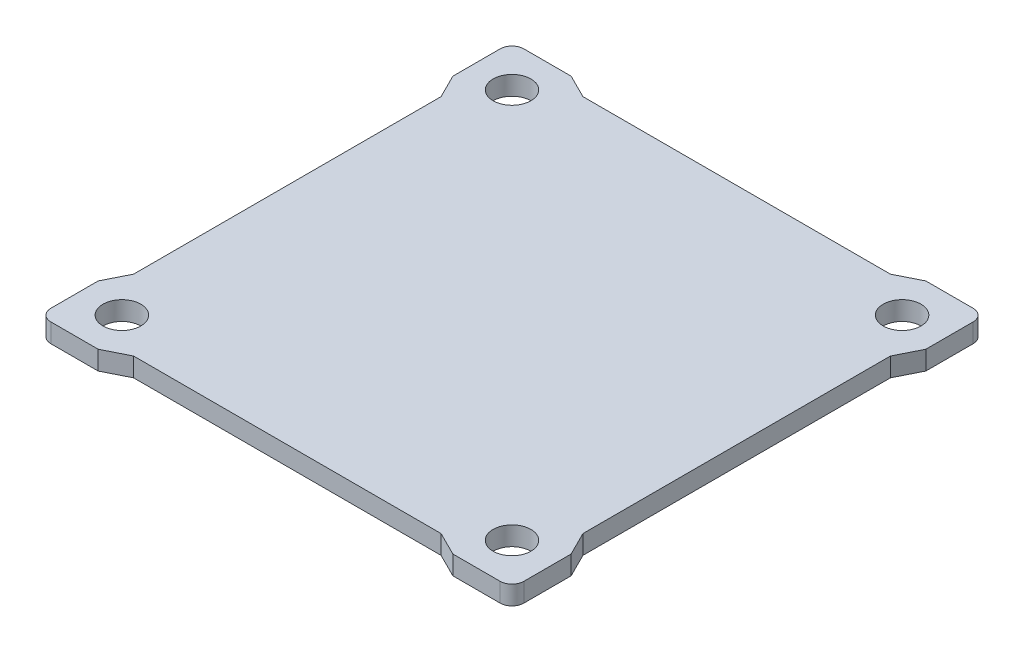
ISO-10303-21;
HEADER;
FILE_DESCRIPTION(('STEP AP214'),'2;1');
FILE_NAME('part.step','',(''),(''),'','','');
FILE_SCHEMA(('AUTOMOTIVE_DESIGN { 1 0 10303 214 1 1 1 1 }'));
ENDSEC;
DATA;
#1=APPLICATION_CONTEXT('core data for automotive mechanical design processes');
#2=APPLICATION_PROTOCOL_DEFINITION('international standard','automotive_design',2000,#1);
#3=PRODUCT_CONTEXT('',#1,'mechanical');
#4=PRODUCT('Part','Part','',(#3));
#5=PRODUCT_RELATED_PRODUCT_CATEGORY('part','',(#4));
#6=PRODUCT_DEFINITION_FORMATION('','',#4);
#7=PRODUCT_DEFINITION_CONTEXT('part definition',#1,'design');
#8=PRODUCT_DEFINITION('design','',#6,#7);
#9=PRODUCT_DEFINITION_SHAPE('','',#8);
#10=(LENGTH_UNIT() NAMED_UNIT(*) SI_UNIT(.MILLI.,.METRE.));
#11=(NAMED_UNIT(*) PLANE_ANGLE_UNIT() SI_UNIT($,.RADIAN.));
#12=(NAMED_UNIT(*) SI_UNIT($,.STERADIAN.) SOLID_ANGLE_UNIT());
#13=UNCERTAINTY_MEASURE_WITH_UNIT(LENGTH_MEASURE(1.E-05),#10,'distance_accuracy_value','');
#14=(GEOMETRIC_REPRESENTATION_CONTEXT(3) GLOBAL_UNCERTAINTY_ASSIGNED_CONTEXT((#13)) GLOBAL_UNIT_ASSIGNED_CONTEXT((#10,
#11,#12)) REPRESENTATION_CONTEXT('',''));
#15=CARTESIAN_POINT('',(0.,0.,0.));
#16=DIRECTION('',(0.,0.,1.));
#17=DIRECTION('',(1.,0.,0.));
#18=AXIS2_PLACEMENT_3D('',#15,#16,#17);
#19=CARTESIAN_POINT('',(0.,0.,0.));
#20=DIRECTION('',(0.,0.,-1.));
#21=DIRECTION('',(-1.,0.,0.));
#22=AXIS2_PLACEMENT_3D('',#19,#20,#21);
#23=PLANE('',#22);
#24=DIRECTION('',(1.,0.,0.));
#25=VECTOR('',#24,1.);
#26=CARTESIAN_POINT('',(0.,-1.6,0.));
#27=LINE('',#26,#25);
#28=CARTESIAN_POINT('',(35.,-1.6,1.45716771982052E-13));
#29=VERTEX_POINT('',#28);
#30=CARTESIAN_POINT('',(39.,-1.6,0.));
#31=VERTEX_POINT('',#30);
#32=EDGE_CURVE('E311',#29,#31,#27,.T.);
#33=ORIENTED_EDGE('',*,*,#32,.T.);
#34=DIRECTION('',(0.,-1.,0.));
#35=VECTOR('',#34,1.);
#36=CARTESIAN_POINT('',(39.,0.,0.));
#37=LINE('',#36,#35);
#38=CARTESIAN_POINT('',(39.,0.,0.));
#39=VERTEX_POINT('',#38);
#40=EDGE_CURVE('E327',#31,#39,#37,.F.);
#41=ORIENTED_EDGE('',*,*,#40,.T.);
#42=DIRECTION('',(1.,0.,0.));
#43=VECTOR('',#42,1.);
#44=CARTESIAN_POINT('',(0.,0.,0.));
#45=LINE('',#44,#43);
#46=CARTESIAN_POINT('',(35.,0.,1.45716771982052E-13));
#47=VERTEX_POINT('',#46);
#48=EDGE_CURVE('E301',#47,#39,#45,.T.);
#49=ORIENTED_EDGE('',*,*,#48,.F.);
#50=DIRECTION('',(0.,1.,0.));
#51=VECTOR('',#50,1.);
#52=CARTESIAN_POINT('',(35.,-1.6,1.45716771982052E-13));
#53=LINE('',#52,#51);
#54=EDGE_CURVE('E236',#29,#47,#53,.T.);
#55=ORIENTED_EDGE('',*,*,#54,.F.);
#56=EDGE_LOOP('',(#33,#41,#49,#55));
#57=FACE_BOUND('',#56,.T.);
#58=ADVANCED_FACE('F16',(#57),#23,.F.);
#59=CARTESIAN_POINT('',(40.,0.,-40.));
#60=DIRECTION('',(1.,0.,0.));
#61=DIRECTION('',(0.,0.,-1.));
#62=AXIS2_PLACEMENT_3D('',#59,#60,#61);
#63=PLANE('',#62);
#64=DIRECTION('',(0.,0.,1.));
#65=VECTOR('',#64,1.);
#66=CARTESIAN_POINT('',(40.,0.,-40.));
#67=LINE('',#66,#65);
#68=CARTESIAN_POINT('',(40.,0.,-5.));
#69=VERTEX_POINT('',#68);
#70=CARTESIAN_POINT('',(40.,0.,-1.));
#71=VERTEX_POINT('',#70);
#72=EDGE_CURVE('E300',#69,#71,#67,.T.);
#73=ORIENTED_EDGE('',*,*,#72,.T.);
#74=DIRECTION('',(0.,-1.,0.));
#75=VECTOR('',#74,1.);
#76=CARTESIAN_POINT('',(40.,-1.6,-1.));
#77=LINE('',#76,#75);
#78=CARTESIAN_POINT('',(40.,-1.6,-1.));
#79=VERTEX_POINT('',#78);
#80=EDGE_CURVE('E309',#71,#79,#77,.T.);
#81=ORIENTED_EDGE('',*,*,#80,.T.);
#82=DIRECTION('',(0.,0.,1.));
#83=VECTOR('',#82,1.);
#84=CARTESIAN_POINT('',(40.,-1.6,-40.));
#85=LINE('',#84,#83);
#86=CARTESIAN_POINT('',(40.,-1.6,-5.));
#87=VERTEX_POINT('',#86);
#88=EDGE_CURVE('E192',#87,#79,#85,.T.);
#89=ORIENTED_EDGE('',*,*,#88,.F.);
#90=DIRECTION('',(0.,1.,0.));
#91=VECTOR('',#90,1.);
#92=CARTESIAN_POINT('',(40.,-1.6,-5.));
#93=LINE('',#92,#91);
#94=EDGE_CURVE('E396',#87,#69,#93,.T.);
#95=ORIENTED_EDGE('',*,*,#94,.T.);
#96=EDGE_LOOP('',(#73,#81,#89,#95));
#97=FACE_BOUND('',#96,.T.);
#98=ADVANCED_FACE('F411',(#97),#63,.T.);
#99=CARTESIAN_POINT('',(0.,0.,-40.));
#100=DIRECTION('',(0.,0.,-1.));
#101=DIRECTION('',(-1.,0.,0.));
#102=AXIS2_PLACEMENT_3D('',#99,#100,#101);
#103=PLANE('',#102);
#104=DIRECTION('',(1.,0.,0.));
#105=VECTOR('',#104,1.);
#106=CARTESIAN_POINT('',(0.,-1.6,-40.));
#107=LINE('',#106,#105);
#108=CARTESIAN_POINT('',(1.,-1.6,-40.));
#109=VERTEX_POINT('',#108);
#110=CARTESIAN_POINT('',(4.99999999999985,-1.6,-40.));
#111=VERTEX_POINT('',#110);
#112=EDGE_CURVE('E313',#109,#111,#107,.T.);
#113=ORIENTED_EDGE('',*,*,#112,.F.);
#114=DIRECTION('',(0.,-1.,0.));
#115=VECTOR('',#114,1.);
#116=CARTESIAN_POINT('',(1.,0.,-40.));
#117=LINE('',#116,#115);
#118=CARTESIAN_POINT('',(1.,0.,-40.));
#119=VERTEX_POINT('',#118);
#120=EDGE_CURVE('E343',#109,#119,#117,.F.);
#121=ORIENTED_EDGE('',*,*,#120,.T.);
#122=DIRECTION('',(1.,0.,0.));
#123=VECTOR('',#122,1.);
#124=CARTESIAN_POINT('',(0.,0.,-40.));
#125=LINE('',#124,#123);
#126=CARTESIAN_POINT('',(4.99999999999985,0.,-40.));
#127=VERTEX_POINT('',#126);
#128=EDGE_CURVE('E304',#119,#127,#125,.T.);
#129=ORIENTED_EDGE('',*,*,#128,.T.);
#130=DIRECTION('',(0.,1.,0.));
#131=VECTOR('',#130,1.);
#132=CARTESIAN_POINT('',(4.99999999999985,-1.6,-40.));
#133=LINE('',#132,#131);
#134=EDGE_CURVE('E260',#111,#127,#133,.T.);
#135=ORIENTED_EDGE('',*,*,#134,.F.);
#136=EDGE_LOOP('',(#113,#121,#129,#135));
#137=FACE_BOUND('',#136,.T.);
#138=ADVANCED_FACE('F467',(#137),#103,.T.);
#139=CARTESIAN_POINT('',(0.,0.,-40.));
#140=DIRECTION('',(1.,0.,0.));
#141=DIRECTION('',(0.,0.,-1.));
#142=AXIS2_PLACEMENT_3D('',#139,#140,#141);
#143=PLANE('',#142);
#144=DIRECTION('',(0.,0.,1.));
#145=VECTOR('',#144,1.);
#146=CARTESIAN_POINT('',(0.,-1.6,-40.));
#147=LINE('',#146,#145);
#148=CARTESIAN_POINT('',(2.35922392732846E-13,-1.6,-4.99999999999947));
#149=VERTEX_POINT('',#148);
#150=CARTESIAN_POINT('',(0.,-1.6,-1.));
#151=VERTEX_POINT('',#150);
#152=EDGE_CURVE('E315',#149,#151,#147,.T.);
#153=ORIENTED_EDGE('',*,*,#152,.T.);
#154=DIRECTION('',(0.,-1.,0.));
#155=VECTOR('',#154,1.);
#156=CARTESIAN_POINT('',(0.,0.,-1.));
#157=LINE('',#156,#155);
#158=CARTESIAN_POINT('',(0.,0.,-1.));
#159=VERTEX_POINT('',#158);
#160=EDGE_CURVE('E41',#151,#159,#157,.F.);
#161=ORIENTED_EDGE('',*,*,#160,.T.);
#162=DIRECTION('',(0.,0.,1.));
#163=VECTOR('',#162,1.);
#164=CARTESIAN_POINT('',(0.,0.,-40.));
#165=LINE('',#164,#163);
#166=CARTESIAN_POINT('',(2.35922392732846E-13,0.,-4.99999999999947));
#167=VERTEX_POINT('',#166);
#168=EDGE_CURVE('E306',#167,#159,#165,.T.);
#169=ORIENTED_EDGE('',*,*,#168,.F.);
#170=DIRECTION('',(0.,1.,0.));
#171=VECTOR('',#170,1.);
#172=CARTESIAN_POINT('',(2.35922392732846E-13,-1.6,-4.99999999999947));
#173=LINE('',#172,#171);
#174=EDGE_CURVE('E231',#149,#167,#173,.T.);
#175=ORIENTED_EDGE('',*,*,#174,.F.);
#176=EDGE_LOOP('',(#153,#161,#169,#175));
#177=FACE_BOUND('',#176,.T.);
#178=ADVANCED_FACE('F441',(#177),#143,.F.);
#179=CARTESIAN_POINT('',(1.,0.,0.));
#180=VERTEX_POINT('',#179);
#181=CARTESIAN_POINT('',(5.00000000000037,0.,1.52655665885959E-13));
#182=VERTEX_POINT('',#181);
#183=EDGE_CURVE('E298',#180,#182,#45,.T.);
#184=ORIENTED_EDGE('',*,*,#183,.F.);
#185=DIRECTION('',(0.,-1.,0.));
#186=VECTOR('',#185,1.);
#187=CARTESIAN_POINT('',(1.,0.,0.));
#188=LINE('',#187,#186);
#189=CARTESIAN_POINT('',(1.,-1.6,0.));
#190=VERTEX_POINT('',#189);
#191=EDGE_CURVE('E336',#180,#190,#188,.T.);
#192=ORIENTED_EDGE('',*,*,#191,.T.);
#193=CARTESIAN_POINT('',(5.00000000000037,-1.6,1.52655665885959E-13));
#194=VERTEX_POINT('',#193);
#195=EDGE_CURVE('E310',#190,#194,#27,.T.);
#196=ORIENTED_EDGE('',*,*,#195,.T.);
#197=DIRECTION('',(0.,1.,0.));
#198=VECTOR('',#197,1.);
#199=CARTESIAN_POINT('',(5.00000000000037,-1.6,1.52655665885959E-13));
#200=LINE('',#199,#198);
#201=EDGE_CURVE('E239',#194,#182,#200,.T.);
#202=ORIENTED_EDGE('',*,*,#201,.T.);
#203=EDGE_LOOP('',(#184,#192,#196,#202));
#204=FACE_BOUND('',#203,.T.);
#205=ADVANCED_FACE('F435',(#204),#23,.F.);
#206=CARTESIAN_POINT('',(40.,-1.6,-39.));
#207=VERTEX_POINT('',#206);
#208=CARTESIAN_POINT('',(40.,-1.6,-35.));
#209=VERTEX_POINT('',#208);
#210=EDGE_CURVE('E180',#207,#209,#85,.T.);
#211=ORIENTED_EDGE('',*,*,#210,.F.);
#212=DIRECTION('',(0.,-1.,0.));
#213=VECTOR('',#212,1.);
#214=CARTESIAN_POINT('',(40.,0.,-39.));
#215=LINE('',#214,#213);
#216=CARTESIAN_POINT('',(40.,0.,-39.));
#217=VERTEX_POINT('',#216);
#218=EDGE_CURVE('E11',#207,#217,#215,.F.);
#219=ORIENTED_EDGE('',*,*,#218,.T.);
#220=CARTESIAN_POINT('',(40.,0.,-35.));
#221=VERTEX_POINT('',#220);
#222=EDGE_CURVE('E207',#217,#221,#67,.T.);
#223=ORIENTED_EDGE('',*,*,#222,.T.);
#224=DIRECTION('',(0.,1.,0.));
#225=VECTOR('',#224,1.);
#226=CARTESIAN_POINT('',(40.,-1.6,-35.));
#227=LINE('',#226,#225);
#228=EDGE_CURVE('E199',#209,#221,#227,.T.);
#229=ORIENTED_EDGE('',*,*,#228,.F.);
#230=EDGE_LOOP('',(#211,#219,#223,#229));
#231=FACE_BOUND('',#230,.T.);
#232=ADVANCED_FACE('F205',(#231),#63,.T.);
#233=CARTESIAN_POINT('',(35.,0.,-40.));
#234=VERTEX_POINT('',#233);
#235=CARTESIAN_POINT('',(39.,0.,-40.));
#236=VERTEX_POINT('',#235);
#237=EDGE_CURVE('E303',#234,#236,#125,.T.);
#238=ORIENTED_EDGE('',*,*,#237,.T.);
#239=DIRECTION('',(0.,-1.,0.));
#240=VECTOR('',#239,1.);
#241=CARTESIAN_POINT('',(39.,0.,-40.));
#242=LINE('',#241,#240);
#243=CARTESIAN_POINT('',(39.,-1.6,-40.));
#244=VERTEX_POINT('',#243);
#245=EDGE_CURVE('E25',#236,#244,#242,.T.);
#246=ORIENTED_EDGE('',*,*,#245,.T.);
#247=CARTESIAN_POINT('',(35.,-1.6,-40.));
#248=VERTEX_POINT('',#247);
#249=EDGE_CURVE('E191',#248,#244,#107,.T.);
#250=ORIENTED_EDGE('',*,*,#249,.F.);
#251=DIRECTION('',(0.,1.,0.));
#252=VECTOR('',#251,1.);
#253=CARTESIAN_POINT('',(35.,-1.6,-40.));
#254=LINE('',#253,#252);
#255=EDGE_CURVE('E292',#248,#234,#254,.T.);
#256=ORIENTED_EDGE('',*,*,#255,.T.);
#257=EDGE_LOOP('',(#238,#246,#250,#256));
#258=FACE_BOUND('',#257,.T.);
#259=ADVANCED_FACE('F482',(#258),#103,.T.);
#260=CARTESIAN_POINT('',(0.,0.,-39.));
#261=VERTEX_POINT('',#260);
#262=CARTESIAN_POINT('',(2.22044604925032E-13,0.,-34.9999999999995));
#263=VERTEX_POINT('',#262);
#264=EDGE_CURVE('E307',#261,#263,#165,.T.);
#265=ORIENTED_EDGE('',*,*,#264,.F.);
#266=DIRECTION('',(0.,-1.,0.));
#267=VECTOR('',#266,1.);
#268=CARTESIAN_POINT('',(0.,-1.6,-39.));
#269=LINE('',#268,#267);
#270=CARTESIAN_POINT('',(0.,-1.6,-39.));
#271=VERTEX_POINT('',#270);
#272=EDGE_CURVE('E340',#261,#271,#269,.T.);
#273=ORIENTED_EDGE('',*,*,#272,.T.);
#274=CARTESIAN_POINT('',(2.22044604925032E-13,-1.6,-34.9999999999995));
#275=VERTEX_POINT('',#274);
#276=EDGE_CURVE('E316',#271,#275,#147,.T.);
#277=ORIENTED_EDGE('',*,*,#276,.T.);
#278=DIRECTION('',(0.,1.,0.));
#279=VECTOR('',#278,1.);
#280=CARTESIAN_POINT('',(2.22044604925032E-13,-1.6,-34.9999999999995));
#281=LINE('',#280,#279);
#282=EDGE_CURVE('E266',#275,#263,#281,.T.);
#283=ORIENTED_EDGE('',*,*,#282,.T.);
#284=EDGE_LOOP('',(#265,#273,#277,#283));
#285=FACE_BOUND('',#284,.T.);
#286=ADVANCED_FACE('F457',(#285),#143,.F.);
#287=CARTESIAN_POINT('',(20.,0.,-20.));
#288=DIRECTION('',(0.,-1.,0.));
#289=DIRECTION('',(0.,0.,-1.));
#290=AXIS2_PLACEMENT_3D('',#287,#288,#289);
#291=PLANE('',#290);
#292=CARTESIAN_POINT('',(36.4968012050828,0.,-36.4968012050817));
#293=DIRECTION('',(0.,1.,0.));
#294=DIRECTION('',(0.,0.,1.));
#295=AXIS2_PLACEMENT_3D('',#292,#293,#294);
#296=CIRCLE('',#295,1.6);
#297=CARTESIAN_POINT('',(36.4968012050828,0.,-34.8968012050818));
#298=VERTEX_POINT('',#297);
#299=EDGE_CURVE('E387',#298,#298,#296,.T.);
#300=ORIENTED_EDGE('',*,*,#299,.F.);
#301=EDGE_LOOP('',(#300));
#302=FACE_BOUND('',#301,.T.);
#303=CARTESIAN_POINT('',(3.50319879491842,0.,-36.4968012050822));
#304=DIRECTION('',(0.,1.,0.));
#305=DIRECTION('',(0.,0.,1.));
#306=AXIS2_PLACEMENT_3D('',#303,#304,#305);
#307=CIRCLE('',#306,1.6);
#308=CARTESIAN_POINT('',(3.50319879491842,0.,-34.8968012050822));
#309=VERTEX_POINT('',#308);
#310=EDGE_CURVE('E384',#309,#309,#307,.T.);
#311=ORIENTED_EDGE('',*,*,#310,.F.);
#312=EDGE_LOOP('',(#311));
#313=FACE_BOUND('',#312,.T.);
#314=CARTESIAN_POINT('',(3.50319879491808,0.,-3.50319879491781));
#315=DIRECTION('',(0.,1.,0.));
#316=DIRECTION('',(0.,0.,1.));
#317=AXIS2_PLACEMENT_3D('',#314,#315,#316);
#318=CIRCLE('',#317,1.6);
#319=CARTESIAN_POINT('',(3.50319879491808,0.,-1.90319879491781));
#320=VERTEX_POINT('',#319);
#321=EDGE_CURVE('E381',#320,#320,#318,.T.);
#322=ORIENTED_EDGE('',*,*,#321,.F.);
#323=EDGE_LOOP('',(#322));
#324=FACE_BOUND('',#323,.T.);
#325=CARTESIAN_POINT('',(36.4968012050824,0.,-3.5031987949176));
#326=DIRECTION('',(0.,1.,0.));
#327=DIRECTION('',(0.,0.,1.));
#328=AXIS2_PLACEMENT_3D('',#325,#326,#327);
#329=CIRCLE('',#328,1.6);
#330=CARTESIAN_POINT('',(36.4968012050824,0.,-1.9031987949176));
#331=VERTEX_POINT('',#330);
#332=EDGE_CURVE('E351',#331,#331,#329,.T.);
#333=ORIENTED_EDGE('',*,*,#332,.F.);
#334=EDGE_LOOP('',(#333));
#335=FACE_BOUND('',#334,.T.);
#336=ORIENTED_EDGE('',*,*,#48,.T.);
#337=CARTESIAN_POINT('',(39.,0.,-1.));
#338=DIRECTION('',(0.,-1.,0.));
#339=DIRECTION('',(0.,0.,-1.));
#340=AXIS2_PLACEMENT_3D('',#337,#338,#339);
#341=CIRCLE('',#340,1.);
#342=EDGE_CURVE('E334',#39,#71,#341,.F.);
#343=ORIENTED_EDGE('',*,*,#342,.T.);
#344=ORIENTED_EDGE('',*,*,#72,.F.);
#345=DIRECTION('',(0.447213595499958,0.,0.894427190999916));
#346=VECTOR('',#345,1.);
#347=CARTESIAN_POINT('',(40.,0.,-5.));
#348=LINE('',#347,#346);
#349=CARTESIAN_POINT('',(39.,0.,-7.));
#350=VERTEX_POINT('',#349);
#351=EDGE_CURVE('E203',#350,#69,#348,.T.);
#352=ORIENTED_EDGE('',*,*,#351,.F.);
#353=DIRECTION('',(0.,0.,1.));
#354=VECTOR('',#353,1.);
#355=CARTESIAN_POINT('',(39.,0.,-33.));
#356=LINE('',#355,#354);
#357=CARTESIAN_POINT('',(39.,0.,-33.));
#358=VERTEX_POINT('',#357);
#359=EDGE_CURVE('E392',#358,#350,#356,.T.);
#360=ORIENTED_EDGE('',*,*,#359,.F.);
#361=DIRECTION('',(-0.447213595499958,0.,0.894427190999916));
#362=VECTOR('',#361,1.);
#363=CARTESIAN_POINT('',(40.,0.,-35.));
#364=LINE('',#363,#362);
#365=EDGE_CURVE('E238',#221,#358,#364,.T.);
#366=ORIENTED_EDGE('',*,*,#365,.F.);
#367=ORIENTED_EDGE('',*,*,#222,.F.);
#368=CARTESIAN_POINT('',(39.,0.,-39.));
#369=DIRECTION('',(0.,-1.,0.));
#370=DIRECTION('',(0.,0.,-1.));
#371=AXIS2_PLACEMENT_3D('',#368,#369,#370);
#372=CIRCLE('',#371,1.);
#373=EDGE_CURVE('E329',#217,#236,#372,.F.);
#374=ORIENTED_EDGE('',*,*,#373,.T.);
#375=ORIENTED_EDGE('',*,*,#237,.F.);
#376=DIRECTION('',(0.894427190999916,0.,-0.447213595499958));
#377=VECTOR('',#376,1.);
#378=CARTESIAN_POINT('',(35.,0.,-40.));
#379=LINE('',#378,#377);
#380=CARTESIAN_POINT('',(33.,0.,-39.));
#381=VERTEX_POINT('',#380);
#382=EDGE_CURVE('E276',#381,#234,#379,.T.);
#383=ORIENTED_EDGE('',*,*,#382,.F.);
#384=DIRECTION('',(1.,0.,0.));
#385=VECTOR('',#384,1.);
#386=CARTESIAN_POINT('',(6.99999999999985,0.,-39.));
#387=LINE('',#386,#385);
#388=CARTESIAN_POINT('',(6.99999999999985,0.,-39.));
#389=VERTEX_POINT('',#388);
#390=EDGE_CURVE('E286',#389,#381,#387,.T.);
#391=ORIENTED_EDGE('',*,*,#390,.F.);
#392=DIRECTION('',(0.894427190999915,0.,0.44721359549996));
#393=VECTOR('',#392,1.);
#394=CARTESIAN_POINT('',(4.99999999999985,0.,-40.));
#395=LINE('',#394,#393);
#396=EDGE_CURVE('E283',#127,#389,#395,.T.);
#397=ORIENTED_EDGE('',*,*,#396,.F.);
#398=ORIENTED_EDGE('',*,*,#128,.F.);
#399=CARTESIAN_POINT('',(1.,0.,-39.));
#400=DIRECTION('',(0.,-1.,0.));
#401=DIRECTION('',(0.,0.,-1.));
#402=AXIS2_PLACEMENT_3D('',#399,#400,#401);
#403=CIRCLE('',#402,1.);
#404=EDGE_CURVE('E331',#119,#261,#403,.F.);
#405=ORIENTED_EDGE('',*,*,#404,.T.);
#406=ORIENTED_EDGE('',*,*,#264,.T.);
#407=DIRECTION('',(-0.447213595499961,0.,-0.894427190999915));
#408=VECTOR('',#407,1.);
#409=CARTESIAN_POINT('',(2.22044604925032E-13,0.,-34.9999999999995));
#410=LINE('',#409,#408);
#411=CARTESIAN_POINT('',(1.00000000000023,0.,-32.9999999999995));
#412=VERTEX_POINT('',#411);
#413=EDGE_CURVE('E249',#412,#263,#410,.T.);
#414=ORIENTED_EDGE('',*,*,#413,.F.);
#415=DIRECTION('',(0.,0.,-1.));
#416=VECTOR('',#415,1.);
#417=CARTESIAN_POINT('',(1.00000000000024,0.,-6.99999999999948));
#418=LINE('',#417,#416);
#419=CARTESIAN_POINT('',(1.00000000000024,0.,-6.99999999999948));
#420=VERTEX_POINT('',#419);
#421=EDGE_CURVE('E259',#420,#412,#418,.T.);
#422=ORIENTED_EDGE('',*,*,#421,.F.);
#423=DIRECTION('',(0.447213595499961,0.,-0.894427190999915));
#424=VECTOR('',#423,1.);
#425=CARTESIAN_POINT('',(2.35922392732846E-13,0.,-4.99999999999947));
#426=LINE('',#425,#424);
#427=EDGE_CURVE('E256',#167,#420,#426,.T.);
#428=ORIENTED_EDGE('',*,*,#427,.F.);
#429=ORIENTED_EDGE('',*,*,#168,.T.);
#430=CARTESIAN_POINT('',(1.,0.,-1.));
#431=DIRECTION('',(0.,-1.,0.));
#432=DIRECTION('',(0.,0.,-1.));
#433=AXIS2_PLACEMENT_3D('',#430,#431,#432);
#434=CIRCLE('',#433,1.);
#435=EDGE_CURVE('E33',#159,#180,#434,.F.);
#436=ORIENTED_EDGE('',*,*,#435,.T.);
#437=ORIENTED_EDGE('',*,*,#183,.T.);
#438=DIRECTION('',(-0.894427190999915,0.,0.447213595499961));
#439=VECTOR('',#438,1.);
#440=CARTESIAN_POINT('',(5.00000000000037,0.,1.52655665885959E-13));
#441=LINE('',#440,#439);
#442=CARTESIAN_POINT('',(7.00000000000037,0.,-0.999999999999855));
#443=VERTEX_POINT('',#442);
#444=EDGE_CURVE('E220',#443,#182,#441,.T.);
#445=ORIENTED_EDGE('',*,*,#444,.F.);
#446=DIRECTION('',(-1.,0.,0.));
#447=VECTOR('',#446,1.);
#448=CARTESIAN_POINT('',(33.0000000000004,0.,-0.999999999999862));
#449=LINE('',#448,#447);
#450=CARTESIAN_POINT('',(33.0000000000004,0.,-0.999999999999862));
#451=VERTEX_POINT('',#450);
#452=EDGE_CURVE('E230',#451,#443,#449,.T.);
#453=ORIENTED_EDGE('',*,*,#452,.F.);
#454=DIRECTION('',(-0.894427190999915,0.,-0.447213595499961));
#455=VECTOR('',#454,1.);
#456=CARTESIAN_POINT('',(35.,0.,1.45716771982052E-13));
#457=LINE('',#456,#455);
#458=EDGE_CURVE('E227',#47,#451,#457,.T.);
#459=ORIENTED_EDGE('',*,*,#458,.F.);
#460=EDGE_LOOP('',(#336,#343,#344,#352,#360,#366,#367,#374,#375,#383,#391,#397,#398,#405,#406,
#414,#422,#428,#429,#436,#437,#445,#453,#459));
#461=FACE_BOUND('',#460,.T.);
#462=ADVANCED_FACE('F366',(#302,#313,#324,#335,#461),#291,.F.);
#463=CARTESIAN_POINT('',(20.,-1.6,-20.));
#464=DIRECTION('',(0.,-1.,0.));
#465=DIRECTION('',(0.,0.,-1.));
#466=AXIS2_PLACEMENT_3D('',#463,#464,#465);
#467=PLANE('',#466);
#468=CARTESIAN_POINT('',(36.4968012050828,-1.6,-36.4968012050817));
#469=DIRECTION('',(0.,-1.,0.));
#470=DIRECTION('',(0.,0.,-1.));
#471=AXIS2_PLACEMENT_3D('',#468,#469,#470);
#472=CIRCLE('',#471,1.6);
#473=CARTESIAN_POINT('',(36.4968012050828,-1.6,-38.0968012050817));
#474=VERTEX_POINT('',#473);
#475=EDGE_CURVE('E20',#474,#474,#472,.T.);
#476=ORIENTED_EDGE('',*,*,#475,.F.);
#477=EDGE_LOOP('',(#476));
#478=FACE_BOUND('',#477,.T.);
#479=CARTESIAN_POINT('',(3.50319879491842,-1.6,-36.4968012050822));
#480=DIRECTION('',(0.,-1.,0.));
#481=DIRECTION('',(0.,0.,-1.));
#482=AXIS2_PLACEMENT_3D('',#479,#480,#481);
#483=CIRCLE('',#482,1.6);
#484=CARTESIAN_POINT('',(3.50319879491842,-1.6,-38.0968012050822));
#485=VERTEX_POINT('',#484);
#486=EDGE_CURVE('E353',#485,#485,#483,.T.);
#487=ORIENTED_EDGE('',*,*,#486,.F.);
#488=EDGE_LOOP('',(#487));
#489=FACE_BOUND('',#488,.T.);
#490=CARTESIAN_POINT('',(3.50319879491808,-1.6,-3.50319879491781));
#491=DIRECTION('',(0.,-1.,0.));
#492=DIRECTION('',(0.,0.,-1.));
#493=AXIS2_PLACEMENT_3D('',#490,#491,#492);
#494=CIRCLE('',#493,1.6);
#495=CARTESIAN_POINT('',(3.50319879491808,-1.6,-5.10319879491781));
#496=VERTEX_POINT('',#495);
#497=EDGE_CURVE('E350',#496,#496,#494,.T.);
#498=ORIENTED_EDGE('',*,*,#497,.F.);
#499=EDGE_LOOP('',(#498));
#500=FACE_BOUND('',#499,.T.);
#501=CARTESIAN_POINT('',(36.4968012050824,-1.6,-3.5031987949176));
#502=DIRECTION('',(0.,-1.,0.));
#503=DIRECTION('',(0.,0.,-1.));
#504=AXIS2_PLACEMENT_3D('',#501,#502,#503);
#505=CIRCLE('',#504,1.6);
#506=CARTESIAN_POINT('',(36.4968012050824,-1.6,-5.10319879491759));
#507=VERTEX_POINT('',#506);
#508=EDGE_CURVE('E347',#507,#507,#505,.T.);
#509=ORIENTED_EDGE('',*,*,#508,.F.);
#510=EDGE_LOOP('',(#509));
#511=FACE_BOUND('',#510,.T.);
#512=ORIENTED_EDGE('',*,*,#88,.T.);
#513=CARTESIAN_POINT('',(39.,-1.6,-1.));
#514=DIRECTION('',(0.,-1.,0.));
#515=DIRECTION('',(0.,0.,-1.));
#516=AXIS2_PLACEMENT_3D('',#513,#514,#515);
#517=CIRCLE('',#516,1.);
#518=EDGE_CURVE('E325',#79,#31,#517,.T.);
#519=ORIENTED_EDGE('',*,*,#518,.T.);
#520=ORIENTED_EDGE('',*,*,#32,.F.);
#521=DIRECTION('',(-0.894427190999915,0.,-0.447213595499961));
#522=VECTOR('',#521,1.);
#523=CARTESIAN_POINT('',(35.,-1.6,1.45716771982052E-13));
#524=LINE('',#523,#522);
#525=CARTESIAN_POINT('',(33.0000000000004,-1.6,-0.999999999999862));
#526=VERTEX_POINT('',#525);
#527=EDGE_CURVE('E216',#29,#526,#524,.T.);
#528=ORIENTED_EDGE('',*,*,#527,.T.);
#529=DIRECTION('',(-1.,0.,0.));
#530=VECTOR('',#529,1.);
#531=CARTESIAN_POINT('',(33.0000000000004,-1.6,-0.999999999999862));
#532=LINE('',#531,#530);
#533=CARTESIAN_POINT('',(7.00000000000037,-1.6,-0.999999999999855));
#534=VERTEX_POINT('',#533);
#535=EDGE_CURVE('E219',#526,#534,#532,.T.);
#536=ORIENTED_EDGE('',*,*,#535,.T.);
#537=DIRECTION('',(-0.894427190999915,0.,0.447213595499961));
#538=VECTOR('',#537,1.);
#539=CARTESIAN_POINT('',(5.00000000000037,-1.6,1.52655665885959E-13));
#540=LINE('',#539,#538);
#541=EDGE_CURVE('E223',#534,#194,#540,.T.);
#542=ORIENTED_EDGE('',*,*,#541,.T.);
#543=ORIENTED_EDGE('',*,*,#195,.F.);
#544=CARTESIAN_POINT('',(1.,-1.6,-1.));
#545=DIRECTION('',(0.,-1.,0.));
#546=DIRECTION('',(0.,0.,-1.));
#547=AXIS2_PLACEMENT_3D('',#544,#545,#546);
#548=CIRCLE('',#547,1.);
#549=EDGE_CURVE('E323',#190,#151,#548,.T.);
#550=ORIENTED_EDGE('',*,*,#549,.T.);
#551=ORIENTED_EDGE('',*,*,#152,.F.);
#552=DIRECTION('',(0.447213595499961,0.,-0.894427190999915));
#553=VECTOR('',#552,1.);
#554=CARTESIAN_POINT('',(2.35922392732846E-13,-1.6,-4.99999999999947));
#555=LINE('',#554,#553);
#556=CARTESIAN_POINT('',(1.00000000000024,-1.6,-6.99999999999948));
#557=VERTEX_POINT('',#556);
#558=EDGE_CURVE('E245',#149,#557,#555,.T.);
#559=ORIENTED_EDGE('',*,*,#558,.T.);
#560=DIRECTION('',(0.,0.,-1.));
#561=VECTOR('',#560,1.);
#562=CARTESIAN_POINT('',(1.00000000000024,-1.6,-6.99999999999948));
#563=LINE('',#562,#561);
#564=CARTESIAN_POINT('',(1.00000000000023,-1.6,-32.9999999999995));
#565=VERTEX_POINT('',#564);
#566=EDGE_CURVE('E248',#557,#565,#563,.T.);
#567=ORIENTED_EDGE('',*,*,#566,.T.);
#568=DIRECTION('',(-0.447213595499961,0.,-0.894427190999915));
#569=VECTOR('',#568,1.);
#570=CARTESIAN_POINT('',(2.22044604925032E-13,-1.6,-34.9999999999995));
#571=LINE('',#570,#569);
#572=EDGE_CURVE('E252',#565,#275,#571,.T.);
#573=ORIENTED_EDGE('',*,*,#572,.T.);
#574=ORIENTED_EDGE('',*,*,#276,.F.);
#575=CARTESIAN_POINT('',(1.,-1.6,-39.));
#576=DIRECTION('',(0.,-1.,0.));
#577=DIRECTION('',(0.,0.,-1.));
#578=AXIS2_PLACEMENT_3D('',#575,#576,#577);
#579=CIRCLE('',#578,1.);
#580=EDGE_CURVE('E321',#271,#109,#579,.T.);
#581=ORIENTED_EDGE('',*,*,#580,.T.);
#582=ORIENTED_EDGE('',*,*,#112,.T.);
#583=DIRECTION('',(0.894427190999915,0.,0.44721359549996));
#584=VECTOR('',#583,1.);
#585=CARTESIAN_POINT('',(4.99999999999985,-1.6,-40.));
#586=LINE('',#585,#584);
#587=CARTESIAN_POINT('',(6.99999999999985,-1.6,-39.));
#588=VERTEX_POINT('',#587);
#589=EDGE_CURVE('E272',#111,#588,#586,.T.);
#590=ORIENTED_EDGE('',*,*,#589,.T.);
#591=DIRECTION('',(1.,0.,0.));
#592=VECTOR('',#591,1.);
#593=CARTESIAN_POINT('',(6.99999999999985,-1.6,-39.));
#594=LINE('',#593,#592);
#595=CARTESIAN_POINT('',(33.,-1.6,-39.));
#596=VERTEX_POINT('',#595);
#597=EDGE_CURVE('E275',#588,#596,#594,.T.);
#598=ORIENTED_EDGE('',*,*,#597,.T.);
#599=DIRECTION('',(0.894427190999916,0.,-0.447213595499958));
#600=VECTOR('',#599,1.);
#601=CARTESIAN_POINT('',(35.,-1.6,-40.));
#602=LINE('',#601,#600);
#603=EDGE_CURVE('E279',#596,#248,#602,.T.);
#604=ORIENTED_EDGE('',*,*,#603,.T.);
#605=ORIENTED_EDGE('',*,*,#249,.T.);
#606=CARTESIAN_POINT('',(39.,-1.6,-39.));
#607=DIRECTION('',(0.,-1.,0.));
#608=DIRECTION('',(0.,0.,-1.));
#609=AXIS2_PLACEMENT_3D('',#606,#607,#608);
#610=CIRCLE('',#609,1.);
#611=EDGE_CURVE('E187',#244,#207,#610,.T.);
#612=ORIENTED_EDGE('',*,*,#611,.T.);
#613=ORIENTED_EDGE('',*,*,#210,.T.);
#614=DIRECTION('',(-0.447213595499958,0.,0.894427190999916));
#615=VECTOR('',#614,1.);
#616=CARTESIAN_POINT('',(40.,-1.6,-35.));
#617=LINE('',#616,#615);
#618=CARTESIAN_POINT('',(39.,-1.6,-33.));
#619=VERTEX_POINT('',#618);
#620=EDGE_CURVE('E185',#209,#619,#617,.T.);
#621=ORIENTED_EDGE('',*,*,#620,.T.);
#622=DIRECTION('',(0.,0.,1.));
#623=VECTOR('',#622,1.);
#624=CARTESIAN_POINT('',(39.,-1.6,-33.));
#625=LINE('',#624,#623);
#626=CARTESIAN_POINT('',(39.,-1.6,-7.));
#627=VERTEX_POINT('',#626);
#628=EDGE_CURVE('E202',#619,#627,#625,.T.);
#629=ORIENTED_EDGE('',*,*,#628,.T.);
#630=DIRECTION('',(0.447213595499958,0.,0.894427190999916));
#631=VECTOR('',#630,1.);
#632=CARTESIAN_POINT('',(40.,-1.6,-5.));
#633=LINE('',#632,#631);
#634=EDGE_CURVE('E208',#627,#87,#633,.T.);
#635=ORIENTED_EDGE('',*,*,#634,.T.);
#636=EDGE_LOOP('',(#512,#519,#520,#528,#536,#542,#543,#550,#551,#559,#567,#573,#574,#581,#582,
#590,#598,#604,#605,#612,#613,#621,#629,#635));
#637=FACE_BOUND('',#636,.T.);
#638=ADVANCED_FACE('F183',(#478,#489,#500,#511,#637),#467,.T.);
#639=CARTESIAN_POINT('',(4.99999999999985,-1.6,-40.));
#640=DIRECTION('',(-0.44721359549996,0.,0.894427190999915));
#641=DIRECTION('',(0.894427190999915,0.,0.44721359549996));
#642=AXIS2_PLACEMENT_3D('',#639,#640,#641);
#643=PLANE('',#642);
#644=ORIENTED_EDGE('',*,*,#396,.T.);
#645=DIRECTION('',(0.,1.,0.));
#646=VECTOR('',#645,1.);
#647=CARTESIAN_POINT('',(6.99999999999985,-1.6,-39.));
#648=LINE('',#647,#646);
#649=EDGE_CURVE('E282',#588,#389,#648,.T.);
#650=ORIENTED_EDGE('',*,*,#649,.F.);
#651=ORIENTED_EDGE('',*,*,#589,.F.);
#652=ORIENTED_EDGE('',*,*,#134,.T.);
#653=EDGE_LOOP('',(#644,#650,#651,#652));
#654=FACE_BOUND('',#653,.T.);
#655=ADVANCED_FACE('F365',(#654),#643,.F.);
#656=CARTESIAN_POINT('',(35.,-1.6,-40.));
#657=DIRECTION('',(0.447213595499958,0.,0.894427190999916));
#658=DIRECTION('',(0.894427190999916,0.,-0.447213595499958));
#659=AXIS2_PLACEMENT_3D('',#656,#657,#658);
#660=PLANE('',#659);
#661=ORIENTED_EDGE('',*,*,#382,.T.);
#662=ORIENTED_EDGE('',*,*,#255,.F.);
#663=ORIENTED_EDGE('',*,*,#603,.F.);
#664=DIRECTION('',(0.,1.,0.));
#665=VECTOR('',#664,1.);
#666=CARTESIAN_POINT('',(33.,-1.6,-39.));
#667=LINE('',#666,#665);
#668=EDGE_CURVE('E295',#596,#381,#667,.T.);
#669=ORIENTED_EDGE('',*,*,#668,.T.);
#670=EDGE_LOOP('',(#661,#662,#663,#669));
#671=FACE_BOUND('',#670,.T.);
#672=ADVANCED_FACE('F531',(#671),#660,.F.);
#673=CARTESIAN_POINT('',(6.99999999999985,-1.6,-39.));
#674=DIRECTION('',(0.,0.,1.));
#675=DIRECTION('',(1.,0.,0.));
#676=AXIS2_PLACEMENT_3D('',#673,#674,#675);
#677=PLANE('',#676);
#678=ORIENTED_EDGE('',*,*,#390,.T.);
#679=ORIENTED_EDGE('',*,*,#668,.F.);
#680=ORIENTED_EDGE('',*,*,#597,.F.);
#681=ORIENTED_EDGE('',*,*,#649,.T.);
#682=EDGE_LOOP('',(#678,#679,#680,#681));
#683=FACE_BOUND('',#682,.T.);
#684=ADVANCED_FACE('F476',(#683),#677,.F.);
#685=CARTESIAN_POINT('',(2.35922392732846E-13,-1.6,-4.99999999999947));
#686=DIRECTION('',(0.894427190999915,0.,0.447213595499961));
#687=DIRECTION('',(0.447213595499961,0.,-0.894427190999915));
#688=AXIS2_PLACEMENT_3D('',#685,#686,#687);
#689=PLANE('',#688);
#690=ORIENTED_EDGE('',*,*,#427,.T.);
#691=DIRECTION('',(0.,1.,0.));
#692=VECTOR('',#691,1.);
#693=CARTESIAN_POINT('',(1.00000000000024,-1.6,-6.99999999999948));
#694=LINE('',#693,#692);
#695=EDGE_CURVE('E255',#557,#420,#694,.T.);
#696=ORIENTED_EDGE('',*,*,#695,.F.);
#697=ORIENTED_EDGE('',*,*,#558,.F.);
#698=ORIENTED_EDGE('',*,*,#174,.T.);
#699=EDGE_LOOP('',(#690,#696,#697,#698));
#700=FACE_BOUND('',#699,.T.);
#701=ADVANCED_FACE('F444',(#700),#689,.F.);
#702=CARTESIAN_POINT('',(2.22044604925032E-13,-1.6,-34.9999999999995));
#703=DIRECTION('',(0.894427190999915,0.,-0.447213595499961));
#704=DIRECTION('',(-0.447213595499961,0.,-0.894427190999915));
#705=AXIS2_PLACEMENT_3D('',#702,#703,#704);
#706=PLANE('',#705);
#707=ORIENTED_EDGE('',*,*,#413,.T.);
#708=ORIENTED_EDGE('',*,*,#282,.F.);
#709=ORIENTED_EDGE('',*,*,#572,.F.);
#710=DIRECTION('',(0.,1.,0.));
#711=VECTOR('',#710,1.);
#712=CARTESIAN_POINT('',(1.00000000000023,-1.6,-32.9999999999995));
#713=LINE('',#712,#711);
#714=EDGE_CURVE('E269',#565,#412,#713,.T.);
#715=ORIENTED_EDGE('',*,*,#714,.T.);
#716=EDGE_LOOP('',(#707,#708,#709,#715));
#717=FACE_BOUND('',#716,.T.);
#718=ADVANCED_FACE('F454',(#717),#706,.F.);
#719=CARTESIAN_POINT('',(1.00000000000024,-1.6,-6.99999999999948));
#720=DIRECTION('',(1.,0.,0.));
#721=DIRECTION('',(0.,0.,-1.));
#722=AXIS2_PLACEMENT_3D('',#719,#720,#721);
#723=PLANE('',#722);
#724=ORIENTED_EDGE('',*,*,#421,.T.);
#725=ORIENTED_EDGE('',*,*,#714,.F.);
#726=ORIENTED_EDGE('',*,*,#566,.F.);
#727=ORIENTED_EDGE('',*,*,#695,.T.);
#728=EDGE_LOOP('',(#724,#725,#726,#727));
#729=FACE_BOUND('',#728,.T.);
#730=ADVANCED_FACE('F449',(#729),#723,.F.);
#731=CARTESIAN_POINT('',(35.,-1.6,1.45716771982052E-13));
#732=DIRECTION('',(0.447213595499961,0.,-0.894427190999915));
#733=DIRECTION('',(-0.894427190999915,0.,-0.447213595499961));
#734=AXIS2_PLACEMENT_3D('',#731,#732,#733);
#735=PLANE('',#734);
#736=ORIENTED_EDGE('',*,*,#458,.T.);
#737=DIRECTION('',(0.,1.,0.));
#738=VECTOR('',#737,1.);
#739=CARTESIAN_POINT('',(33.0000000000004,-1.6,-0.999999999999862));
#740=LINE('',#739,#738);
#741=EDGE_CURVE('E226',#526,#451,#740,.T.);
#742=ORIENTED_EDGE('',*,*,#741,.F.);
#743=ORIENTED_EDGE('',*,*,#527,.F.);
#744=ORIENTED_EDGE('',*,*,#54,.T.);
#745=EDGE_LOOP('',(#736,#742,#743,#744));
#746=FACE_BOUND('',#745,.T.);
#747=ADVANCED_FACE('F423',(#746),#735,.F.);
#748=CARTESIAN_POINT('',(5.00000000000037,-1.6,1.52655665885959E-13));
#749=DIRECTION('',(-0.447213595499961,0.,-0.894427190999915));
#750=DIRECTION('',(-0.894427190999915,0.,0.447213595499961));
#751=AXIS2_PLACEMENT_3D('',#748,#749,#750);
#752=PLANE('',#751);
#753=ORIENTED_EDGE('',*,*,#444,.T.);
#754=ORIENTED_EDGE('',*,*,#201,.F.);
#755=ORIENTED_EDGE('',*,*,#541,.F.);
#756=DIRECTION('',(0.,1.,0.));
#757=VECTOR('',#756,1.);
#758=CARTESIAN_POINT('',(7.00000000000037,-1.6,-0.999999999999855));
#759=LINE('',#758,#757);
#760=EDGE_CURVE('E242',#534,#443,#759,.T.);
#761=ORIENTED_EDGE('',*,*,#760,.T.);
#762=EDGE_LOOP('',(#753,#754,#755,#761));
#763=FACE_BOUND('',#762,.T.);
#764=ADVANCED_FACE('F433',(#763),#752,.F.);
#765=CARTESIAN_POINT('',(33.0000000000004,-1.6,-0.999999999999862));
#766=DIRECTION('',(0.,0.,-1.));
#767=DIRECTION('',(-1.,0.,0.));
#768=AXIS2_PLACEMENT_3D('',#765,#766,#767);
#769=PLANE('',#768);
#770=ORIENTED_EDGE('',*,*,#452,.T.);
#771=ORIENTED_EDGE('',*,*,#760,.F.);
#772=ORIENTED_EDGE('',*,*,#535,.F.);
#773=ORIENTED_EDGE('',*,*,#741,.T.);
#774=EDGE_LOOP('',(#770,#771,#772,#773));
#775=FACE_BOUND('',#774,.T.);
#776=ADVANCED_FACE('F428',(#775),#769,.F.);
#777=CARTESIAN_POINT('',(40.,-1.6,-5.));
#778=DIRECTION('',(-0.894427190999916,0.,0.447213595499958));
#779=DIRECTION('',(0.447213595499958,0.,0.894427190999916));
#780=AXIS2_PLACEMENT_3D('',#777,#778,#779);
#781=PLANE('',#780);
#782=ORIENTED_EDGE('',*,*,#351,.T.);
#783=ORIENTED_EDGE('',*,*,#94,.F.);
#784=ORIENTED_EDGE('',*,*,#634,.F.);
#785=DIRECTION('',(0.,1.,0.));
#786=VECTOR('',#785,1.);
#787=CARTESIAN_POINT('',(39.,-1.6,-7.));
#788=LINE('',#787,#786);
#789=EDGE_CURVE('E210',#627,#350,#788,.T.);
#790=ORIENTED_EDGE('',*,*,#789,.T.);
#791=EDGE_LOOP('',(#782,#783,#784,#790));
#792=FACE_BOUND('',#791,.T.);
#793=ADVANCED_FACE('F400',(#792),#781,.F.);
#794=CARTESIAN_POINT('',(39.,-1.6,-33.));
#795=DIRECTION('',(-1.,0.,0.));
#796=DIRECTION('',(0.,0.,1.));
#797=AXIS2_PLACEMENT_3D('',#794,#795,#796);
#798=PLANE('',#797);
#799=ORIENTED_EDGE('',*,*,#359,.T.);
#800=ORIENTED_EDGE('',*,*,#789,.F.);
#801=ORIENTED_EDGE('',*,*,#628,.F.);
#802=DIRECTION('',(0.,1.,0.));
#803=VECTOR('',#802,1.);
#804=CARTESIAN_POINT('',(39.,-1.6,-33.));
#805=LINE('',#804,#803);
#806=EDGE_CURVE('E201',#619,#358,#805,.T.);
#807=ORIENTED_EDGE('',*,*,#806,.T.);
#808=EDGE_LOOP('',(#799,#800,#801,#807));
#809=FACE_BOUND('',#808,.T.);
#810=ADVANCED_FACE('F404',(#809),#798,.F.);
#811=CARTESIAN_POINT('',(40.,-1.6,-35.));
#812=DIRECTION('',(-0.894427190999916,0.,-0.447213595499958));
#813=DIRECTION('',(-0.447213595499958,0.,0.894427190999916));
#814=AXIS2_PLACEMENT_3D('',#811,#812,#813);
#815=PLANE('',#814);
#816=ORIENTED_EDGE('',*,*,#365,.T.);
#817=ORIENTED_EDGE('',*,*,#806,.F.);
#818=ORIENTED_EDGE('',*,*,#620,.F.);
#819=ORIENTED_EDGE('',*,*,#228,.T.);
#820=EDGE_LOOP('',(#816,#817,#818,#819));
#821=FACE_BOUND('',#820,.T.);
#822=ADVANCED_FACE('F198',(#821),#815,.F.);
#823=CARTESIAN_POINT('',(39.,0.,-1.));
#824=DIRECTION('',(0.,1.,0.));
#825=DIRECTION('',(0.,0.,1.));
#826=AXIS2_PLACEMENT_3D('',#823,#824,#825);
#827=CYLINDRICAL_SURFACE('',#826,1.);
#828=ORIENTED_EDGE('',*,*,#342,.F.);
#829=ORIENTED_EDGE('',*,*,#40,.F.);
#830=ORIENTED_EDGE('',*,*,#518,.F.);
#831=ORIENTED_EDGE('',*,*,#80,.F.);
#832=EDGE_LOOP('',(#828,#829,#830,#831));
#833=FACE_BOUND('',#832,.T.);
#834=ADVANCED_FACE('F414',(#833),#827,.T.);
#835=CARTESIAN_POINT('',(1.,0.,-1.));
#836=DIRECTION('',(0.,-1.,0.));
#837=DIRECTION('',(0.,0.,-1.));
#838=AXIS2_PLACEMENT_3D('',#835,#836,#837);
#839=CYLINDRICAL_SURFACE('',#838,1.);
#840=ORIENTED_EDGE('',*,*,#435,.F.);
#841=ORIENTED_EDGE('',*,*,#160,.F.);
#842=ORIENTED_EDGE('',*,*,#549,.F.);
#843=ORIENTED_EDGE('',*,*,#191,.F.);
#844=EDGE_LOOP('',(#840,#841,#842,#843));
#845=FACE_BOUND('',#844,.T.);
#846=ADVANCED_FACE('F438',(#845),#839,.T.);
#847=CARTESIAN_POINT('',(1.,0.,-39.));
#848=DIRECTION('',(0.,1.,0.));
#849=DIRECTION('',(0.,0.,1.));
#850=AXIS2_PLACEMENT_3D('',#847,#848,#849);
#851=CYLINDRICAL_SURFACE('',#850,1.);
#852=ORIENTED_EDGE('',*,*,#404,.F.);
#853=ORIENTED_EDGE('',*,*,#120,.F.);
#854=ORIENTED_EDGE('',*,*,#580,.F.);
#855=ORIENTED_EDGE('',*,*,#272,.F.);
#856=EDGE_LOOP('',(#852,#853,#854,#855));
#857=FACE_BOUND('',#856,.T.);
#858=ADVANCED_FACE('F461',(#857),#851,.T.);
#859=CARTESIAN_POINT('',(39.,0.,-39.));
#860=DIRECTION('',(0.,-1.,0.));
#861=DIRECTION('',(0.,0.,-1.));
#862=AXIS2_PLACEMENT_3D('',#859,#860,#861);
#863=CYLINDRICAL_SURFACE('',#862,1.);
#864=ORIENTED_EDGE('',*,*,#373,.F.);
#865=ORIENTED_EDGE('',*,*,#218,.F.);
#866=ORIENTED_EDGE('',*,*,#611,.F.);
#867=ORIENTED_EDGE('',*,*,#245,.F.);
#868=EDGE_LOOP('',(#864,#865,#866,#867));
#869=FACE_BOUND('',#868,.T.);
#870=ADVANCED_FACE('F18',(#869),#863,.T.);
#871=CARTESIAN_POINT('',(36.4968012050824,-2.,-3.5031987949176));
#872=DIRECTION('',(0.,1.,0.));
#873=DIRECTION('',(0.,0.,1.));
#874=AXIS2_PLACEMENT_3D('',#871,#872,#873);
#875=CYLINDRICAL_SURFACE('',#874,1.6);
#876=ORIENTED_EDGE('',*,*,#508,.T.);
#877=EDGE_LOOP('',(#876));
#878=FACE_BOUND('',#877,.T.);
#879=ORIENTED_EDGE('',*,*,#332,.T.);
#880=EDGE_LOOP('',(#879));
#881=FACE_BOUND('',#880,.T.);
#882=ADVANCED_FACE('F373',(#878,#881),#875,.F.);
#883=CARTESIAN_POINT('',(3.50319879491808,-2.,-3.50319879491781));
#884=DIRECTION('',(0.,1.,0.));
#885=DIRECTION('',(0.,0.,1.));
#886=AXIS2_PLACEMENT_3D('',#883,#884,#885);
#887=CYLINDRICAL_SURFACE('',#886,1.6);
#888=ORIENTED_EDGE('',*,*,#497,.T.);
#889=EDGE_LOOP('',(#888));
#890=FACE_BOUND('',#889,.T.);
#891=ORIENTED_EDGE('',*,*,#321,.T.);
#892=EDGE_LOOP('',(#891));
#893=FACE_BOUND('',#892,.T.);
#894=ADVANCED_FACE('F376',(#890,#893),#887,.F.);
#895=CARTESIAN_POINT('',(3.50319879491842,-2.,-36.4968012050822));
#896=DIRECTION('',(0.,1.,0.));
#897=DIRECTION('',(0.,0.,1.));
#898=AXIS2_PLACEMENT_3D('',#895,#896,#897);
#899=CYLINDRICAL_SURFACE('',#898,1.6);
#900=ORIENTED_EDGE('',*,*,#486,.T.);
#901=EDGE_LOOP('',(#900));
#902=FACE_BOUND('',#901,.T.);
#903=ORIENTED_EDGE('',*,*,#310,.T.);
#904=EDGE_LOOP('',(#903));
#905=FACE_BOUND('',#904,.T.);
#906=ADVANCED_FACE('F590',(#902,#905),#899,.F.);
#907=CARTESIAN_POINT('',(36.4968012050828,-2.,-36.4968012050817));
#908=DIRECTION('',(0.,1.,0.));
#909=DIRECTION('',(0.,0.,1.));
#910=AXIS2_PLACEMENT_3D('',#907,#908,#909);
#911=CYLINDRICAL_SURFACE('',#910,1.6);
#912=ORIENTED_EDGE('',*,*,#475,.T.);
#913=EDGE_LOOP('',(#912));
#914=FACE_BOUND('',#913,.T.);
#915=ORIENTED_EDGE('',*,*,#299,.T.);
#916=EDGE_LOOP('',(#915));
#917=FACE_BOUND('',#916,.T.);
#918=ADVANCED_FACE('F360',(#914,#917),#911,.F.);
#919=CLOSED_SHELL('',(#58,#98,#138,#178,#205,#232,#259,#286,#462,#638,#655,#672,#684,#701,#718,
#730,#747,#764,#776,#793,#810,#822,#834,#846,#858,#870,#882,#894,#906,#918));
#920=MANIFOLD_SOLID_BREP('B1',#919);
#921=ADVANCED_BREP_SHAPE_REPRESENTATION('',(#18,#920),#14);
#922=SHAPE_DEFINITION_REPRESENTATION(#9,#921);
ENDSEC;
END-ISO-10303-21;
